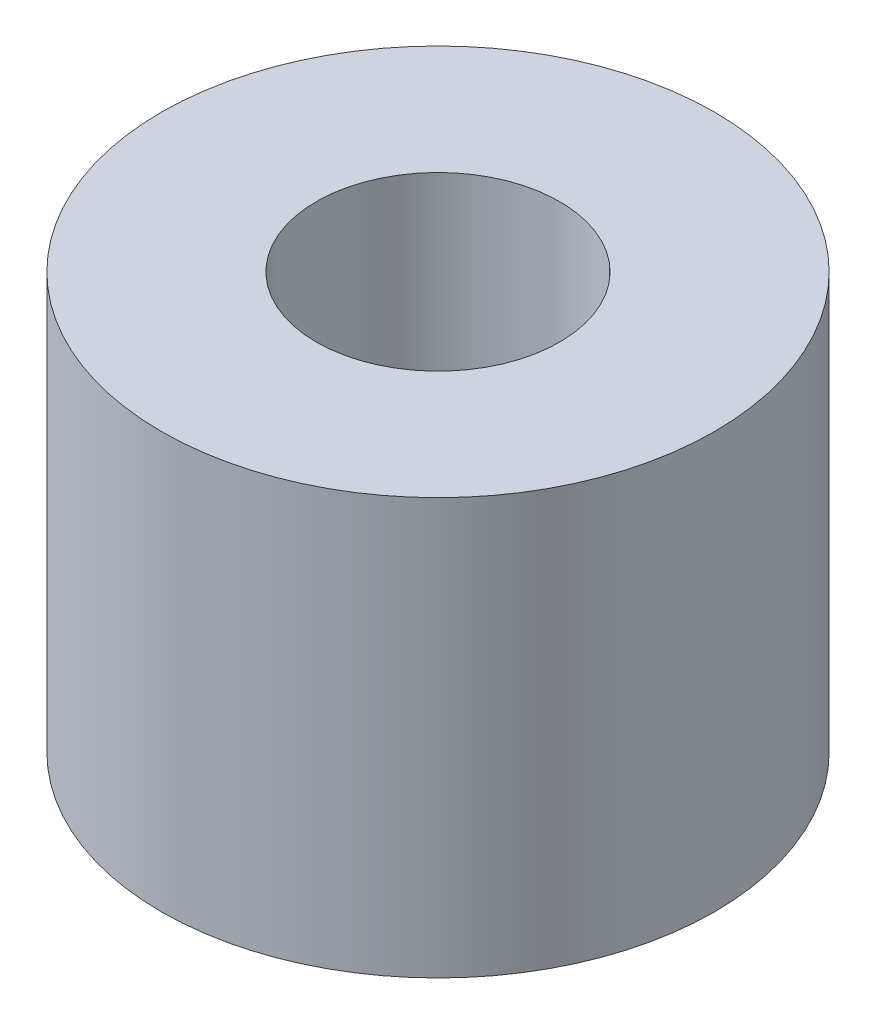
ISO-10303-21;
HEADER;
FILE_DESCRIPTION(('STEP AP214'),'2;1');
FILE_NAME('part.step','',(''),(''),'','','');
FILE_SCHEMA(('AUTOMOTIVE_DESIGN { 1 0 10303 214 1 1 1 1 }'));
ENDSEC;
DATA;
#1=APPLICATION_CONTEXT('core data for automotive mechanical design processes');
#2=APPLICATION_PROTOCOL_DEFINITION('international standard','automotive_design',2000,#1);
#3=PRODUCT_CONTEXT('',#1,'mechanical');
#4=PRODUCT('Part','Part','',(#3));
#5=PRODUCT_RELATED_PRODUCT_CATEGORY('part','',(#4));
#6=PRODUCT_DEFINITION_FORMATION('','',#4);
#7=PRODUCT_DEFINITION_CONTEXT('part definition',#1,'design');
#8=PRODUCT_DEFINITION('design','',#6,#7);
#9=PRODUCT_DEFINITION_SHAPE('','',#8);
#10=(LENGTH_UNIT() NAMED_UNIT(*) SI_UNIT(.MILLI.,.METRE.));
#11=(NAMED_UNIT(*) PLANE_ANGLE_UNIT() SI_UNIT($,.RADIAN.));
#12=(NAMED_UNIT(*) SI_UNIT($,.STERADIAN.) SOLID_ANGLE_UNIT());
#13=UNCERTAINTY_MEASURE_WITH_UNIT(LENGTH_MEASURE(1.E-05),#10,'distance_accuracy_value','');
#14=(GEOMETRIC_REPRESENTATION_CONTEXT(3) GLOBAL_UNCERTAINTY_ASSIGNED_CONTEXT((#13)) GLOBAL_UNIT_ASSIGNED_CONTEXT((#10,
#11,#12)) REPRESENTATION_CONTEXT('',''));
#15=CARTESIAN_POINT('',(0.,0.,0.));
#16=DIRECTION('',(0.,0.,1.));
#17=DIRECTION('',(1.,0.,0.));
#18=AXIS2_PLACEMENT_3D('',#15,#16,#17);
#19=CARTESIAN_POINT('',(0.,37.6,0.));
#20=DIRECTION('',(0.,1.,0.));
#21=DIRECTION('',(0.,0.,1.));
#22=AXIS2_PLACEMENT_3D('',#19,#20,#21);
#23=PLANE('',#22);
#24=CARTESIAN_POINT('',(0.,37.6,0.));
#25=DIRECTION('',(0.,1.,0.));
#26=DIRECTION('',(0.,0.,1.));
#27=AXIS2_PLACEMENT_3D('',#24,#25,#26);
#28=CIRCLE('',#27,25.);
#29=CARTESIAN_POINT('',(0.,37.6,25.));
#30=VERTEX_POINT('',#29);
#31=EDGE_CURVE('E10',#30,#30,#28,.T.);
#32=ORIENTED_EDGE('',*,*,#31,.T.);
#33=EDGE_LOOP('',(#32));
#34=FACE_BOUND('',#33,.T.);
#35=CARTESIAN_POINT('',(0.,37.6,0.));
#36=DIRECTION('',(0.,1.,0.));
#37=DIRECTION('',(0.,0.,1.));
#38=AXIS2_PLACEMENT_3D('',#35,#36,#37);
#39=CIRCLE('',#38,11.);
#40=CARTESIAN_POINT('',(0.,37.6,11.));
#41=VERTEX_POINT('',#40);
#42=EDGE_CURVE('E44',#41,#41,#39,.T.);
#43=ORIENTED_EDGE('',*,*,#42,.F.);
#44=EDGE_LOOP('',(#43));
#45=FACE_BOUND('',#44,.T.);
#46=ADVANCED_FACE('F33',(#34,#45),#23,.T.);
#47=CARTESIAN_POINT('',(0.,0.,0.));
#48=DIRECTION('',(0.,1.,0.));
#49=DIRECTION('',(0.,0.,1.));
#50=AXIS2_PLACEMENT_3D('',#47,#48,#49);
#51=PLANE('',#50);
#52=CARTESIAN_POINT('',(0.,0.,0.));
#53=DIRECTION('',(0.,1.,0.));
#54=DIRECTION('',(0.,0.,1.));
#55=AXIS2_PLACEMENT_3D('',#52,#53,#54);
#56=CIRCLE('',#55,25.);
#57=CARTESIAN_POINT('',(0.,0.,25.));
#58=VERTEX_POINT('',#57);
#59=EDGE_CURVE('E37',#58,#58,#56,.T.);
#60=ORIENTED_EDGE('',*,*,#59,.F.);
#61=EDGE_LOOP('',(#60));
#62=FACE_BOUND('',#61,.T.);
#63=CARTESIAN_POINT('',(0.,0.,0.));
#64=DIRECTION('',(0.,1.,0.));
#65=DIRECTION('',(0.,0.,1.));
#66=AXIS2_PLACEMENT_3D('',#63,#64,#65);
#67=CIRCLE('',#66,11.);
#68=CARTESIAN_POINT('',(0.,0.,11.));
#69=VERTEX_POINT('',#68);
#70=EDGE_CURVE('E46',#69,#69,#67,.T.);
#71=ORIENTED_EDGE('',*,*,#70,.T.);
#72=EDGE_LOOP('',(#71));
#73=FACE_BOUND('',#72,.T.);
#74=ADVANCED_FACE('F56',(#62,#73),#51,.F.);
#75=CARTESIAN_POINT('',(0.,37.6,0.));
#76=DIRECTION('',(0.,-1.,0.));
#77=DIRECTION('',(0.,0.,-1.));
#78=AXIS2_PLACEMENT_3D('',#75,#76,#77);
#79=CYLINDRICAL_SURFACE('',#78,25.);
#80=ORIENTED_EDGE('',*,*,#31,.F.);
#81=EDGE_LOOP('',(#80));
#82=FACE_BOUND('',#81,.T.);
#83=ORIENTED_EDGE('',*,*,#59,.T.);
#84=EDGE_LOOP('',(#83));
#85=FACE_BOUND('',#84,.T.);
#86=ADVANCED_FACE('F35',(#82,#85),#79,.T.);
#87=CARTESIAN_POINT('',(0.,37.6,0.));
#88=DIRECTION('',(0.,-1.,0.));
#89=DIRECTION('',(0.,0.,-1.));
#90=AXIS2_PLACEMENT_3D('',#87,#88,#89);
#91=CYLINDRICAL_SURFACE('',#90,11.);
#92=ORIENTED_EDGE('',*,*,#42,.T.);
#93=EDGE_LOOP('',(#92));
#94=FACE_BOUND('',#93,.T.);
#95=ORIENTED_EDGE('',*,*,#70,.F.);
#96=EDGE_LOOP('',(#95));
#97=FACE_BOUND('',#96,.T.);
#98=ADVANCED_FACE('F52',(#94,#97),#91,.F.);
#99=CLOSED_SHELL('',(#46,#74,#86,#98));
#100=MANIFOLD_SOLID_BREP('B2',#99);
#101=ADVANCED_BREP_SHAPE_REPRESENTATION('',(#18,#100),#14);
#102=SHAPE_DEFINITION_REPRESENTATION(#9,#101);
ENDSEC;
END-ISO-10303-21;
